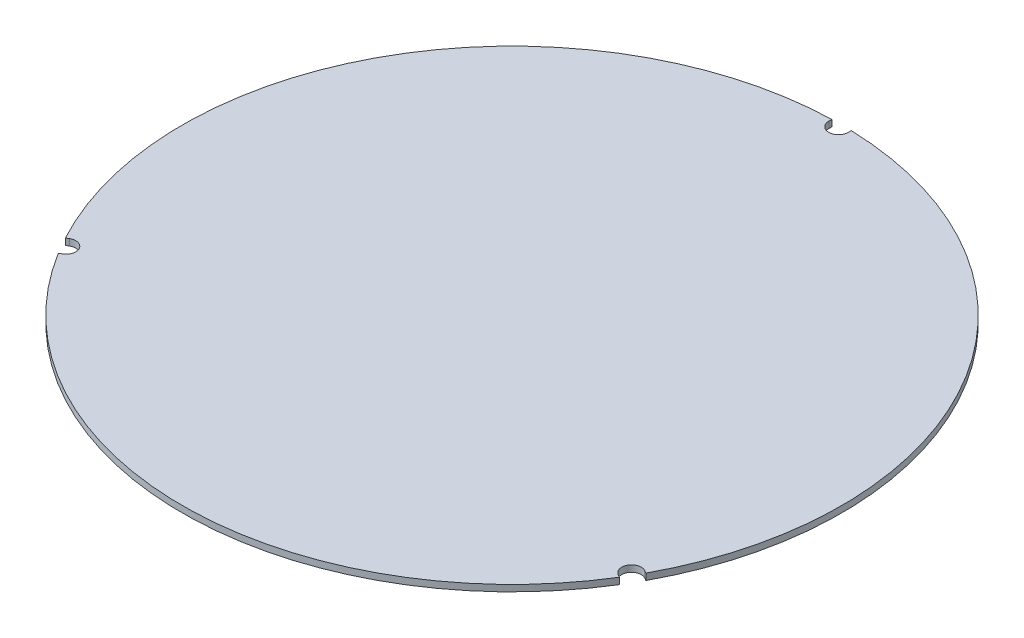
ISO-10303-21;
HEADER;
FILE_DESCRIPTION(('STEP AP214'),'2;1');
FILE_NAME('part.step','',(''),(''),'','','');
FILE_SCHEMA(('AUTOMOTIVE_DESIGN { 1 0 10303 214 1 1 1 1 }'));
ENDSEC;
DATA;
#1=APPLICATION_CONTEXT('core data for automotive mechanical design processes');
#2=APPLICATION_PROTOCOL_DEFINITION('international standard','automotive_design',2000,#1);
#3=PRODUCT_CONTEXT('',#1,'mechanical');
#4=PRODUCT('Part','Part','',(#3));
#5=PRODUCT_RELATED_PRODUCT_CATEGORY('part','',(#4));
#6=PRODUCT_DEFINITION_FORMATION('','',#4);
#7=PRODUCT_DEFINITION_CONTEXT('part definition',#1,'design');
#8=PRODUCT_DEFINITION('design','',#6,#7);
#9=PRODUCT_DEFINITION_SHAPE('','',#8);
#10=(LENGTH_UNIT() NAMED_UNIT(*) SI_UNIT(.MILLI.,.METRE.));
#11=(NAMED_UNIT(*) PLANE_ANGLE_UNIT() SI_UNIT($,.RADIAN.));
#12=(NAMED_UNIT(*) SI_UNIT($,.STERADIAN.) SOLID_ANGLE_UNIT());
#13=UNCERTAINTY_MEASURE_WITH_UNIT(LENGTH_MEASURE(1.E-05),#10,'distance_accuracy_value','');
#14=(GEOMETRIC_REPRESENTATION_CONTEXT(3) GLOBAL_UNCERTAINTY_ASSIGNED_CONTEXT((#13)) GLOBAL_UNIT_ASSIGNED_CONTEXT((#10,
#11,#12)) REPRESENTATION_CONTEXT('',''));
#15=CARTESIAN_POINT('',(0.,0.,0.));
#16=DIRECTION('',(0.,0.,1.));
#17=DIRECTION('',(1.,0.,0.));
#18=AXIS2_PLACEMENT_3D('',#15,#16,#17);
#19=CARTESIAN_POINT('',(0.,0.,-50.5));
#20=DIRECTION('',(0.,1.,0.));
#21=DIRECTION('',(0.,0.,1.));
#22=AXIS2_PLACEMENT_3D('',#19,#20,#21);
#23=CYLINDRICAL_SURFACE('',#22,1.5);
#24=CARTESIAN_POINT('',(0.,1.,-50.5));
#25=DIRECTION('',(0.,1.,0.));
#26=DIRECTION('',(0.,0.,1.));
#27=AXIS2_PLACEMENT_3D('',#24,#25,#26);
#28=CIRCLE('',#27,1.5);
#29=CARTESIAN_POINT('',(-1.5,1.,-50.5));
#30=VERTEX_POINT('',#29);
#31=CARTESIAN_POINT('',(1.5,1.,-50.5));
#32=VERTEX_POINT('',#31);
#33=EDGE_CURVE('E152',#30,#32,#28,.T.);
#34=ORIENTED_EDGE('',*,*,#33,.T.);
#35=DIRECTION('',(0.,1.,0.));
#36=VECTOR('',#35,1.);
#37=CARTESIAN_POINT('',(1.5,0.,-50.5));
#38=LINE('',#37,#36);
#39=CARTESIAN_POINT('',(1.5,0.,-50.5));
#40=VERTEX_POINT('',#39);
#41=EDGE_CURVE('E140',#40,#32,#38,.T.);
#42=ORIENTED_EDGE('',*,*,#41,.F.);
#43=CARTESIAN_POINT('',(0.,0.,-50.5));
#44=DIRECTION('',(0.,1.,0.));
#45=DIRECTION('',(0.,0.,1.));
#46=AXIS2_PLACEMENT_3D('',#43,#44,#45);
#47=CIRCLE('',#46,1.5);
#48=CARTESIAN_POINT('',(-1.5,0.,-50.5));
#49=VERTEX_POINT('',#48);
#50=EDGE_CURVE('E11',#49,#40,#47,.T.);
#51=ORIENTED_EDGE('',*,*,#50,.F.);
#52=DIRECTION('',(0.,1.,0.));
#53=VECTOR('',#52,1.);
#54=CARTESIAN_POINT('',(-1.5,0.,-50.5));
#55=LINE('',#54,#53);
#56=EDGE_CURVE('E129',#49,#30,#55,.T.);
#57=ORIENTED_EDGE('',*,*,#56,.T.);
#58=EDGE_LOOP('',(#34,#42,#51,#57));
#59=FACE_BOUND('',#58,.T.);
#60=ADVANCED_FACE('F41',(#59),#23,.F.);
#61=CARTESIAN_POINT('',(0.,1.,0.));
#62=DIRECTION('',(0.,-1.,0.));
#63=DIRECTION('',(0.,0.,-1.));
#64=AXIS2_PLACEMENT_3D('',#61,#62,#63);
#65=CYLINDRICAL_SURFACE('',#64,51.);
#66=CARTESIAN_POINT('',(0.,0.,0.));
#67=DIRECTION('',(0.,1.,0.));
#68=DIRECTION('',(0.,0.,1.));
#69=AXIS2_PLACEMENT_3D('',#66,#67,#68);
#70=CIRCLE('',#69,51.);
#71=CARTESIAN_POINT('',(44.8981879582846,0.,24.1899300962725));
#72=VERTEX_POINT('',#71);
#73=CARTESIAN_POINT('',(1.5,0.,-50.9779364038993));
#74=VERTEX_POINT('',#73);
#75=EDGE_CURVE('E220',#72,#74,#70,.T.);
#76=ORIENTED_EDGE('',*,*,#75,.T.);
#77=DIRECTION('',(0.,-1.,0.));
#78=VECTOR('',#77,1.);
#79=CARTESIAN_POINT('',(1.5,1.,-50.9779364038993));
#80=LINE('',#79,#78);
#81=CARTESIAN_POINT('',(1.5,1.,-50.9779364038993));
#82=VERTEX_POINT('',#81);
#83=EDGE_CURVE('E157',#74,#82,#80,.F.);
#84=ORIENTED_EDGE('',*,*,#83,.T.);
#85=CARTESIAN_POINT('',(0.,1.,0.));
#86=DIRECTION('',(0.,1.,0.));
#87=DIRECTION('',(0.,0.,1.));
#88=AXIS2_PLACEMENT_3D('',#85,#86,#87);
#89=CIRCLE('',#88,51.);
#90=CARTESIAN_POINT('',(44.8981879582846,1.,24.1899300962725));
#91=VERTEX_POINT('',#90);
#92=EDGE_CURVE('E49',#91,#82,#89,.T.);
#93=ORIENTED_EDGE('',*,*,#92,.F.);
#94=DIRECTION('',(0.,-1.,0.));
#95=VECTOR('',#94,1.);
#96=CARTESIAN_POINT('',(44.8981879582845,1.,24.1899300962725));
#97=LINE('',#96,#95);
#98=EDGE_CURVE('E199',#91,#72,#97,.T.);
#99=ORIENTED_EDGE('',*,*,#98,.T.);
#100=EDGE_LOOP('',(#76,#84,#93,#99));
#101=FACE_BOUND('',#100,.T.);
#102=ADVANCED_FACE('F251',(#101),#65,.T.);
#103=CARTESIAN_POINT('',(-1.5,1.,-50.9779364038993));
#104=VERTEX_POINT('',#103);
#105=CARTESIAN_POINT('',(-44.8981879582842,1.,24.1899300962732));
#106=VERTEX_POINT('',#105);
#107=EDGE_CURVE('E217',#104,#106,#89,.T.);
#108=ORIENTED_EDGE('',*,*,#107,.F.);
#109=DIRECTION('',(0.,-1.,0.));
#110=VECTOR('',#109,1.);
#111=CARTESIAN_POINT('',(-1.5,1.,-50.9779364038993));
#112=LINE('',#111,#110);
#113=CARTESIAN_POINT('',(-1.5,0.,-50.9779364038993));
#114=VERTEX_POINT('',#113);
#115=EDGE_CURVE('E155',#104,#114,#112,.T.);
#116=ORIENTED_EDGE('',*,*,#115,.T.);
#117=CARTESIAN_POINT('',(-44.8981879582842,0.,24.1899300962732));
#118=VERTEX_POINT('',#117);
#119=EDGE_CURVE('E148',#114,#118,#70,.T.);
#120=ORIENTED_EDGE('',*,*,#119,.T.);
#121=DIRECTION('',(0.,-1.,0.));
#122=VECTOR('',#121,1.);
#123=CARTESIAN_POINT('',(-44.8981879582842,1.,24.1899300962732));
#124=LINE('',#123,#122);
#125=EDGE_CURVE('E190',#118,#106,#124,.F.);
#126=ORIENTED_EDGE('',*,*,#125,.T.);
#127=EDGE_LOOP('',(#108,#116,#120,#126));
#128=FACE_BOUND('',#127,.T.);
#129=ADVANCED_FACE('F237',(#128),#65,.T.);
#130=CARTESIAN_POINT('',(-43.3981879582842,0.,26.7880063076265));
#131=VERTEX_POINT('',#130);
#132=CARTESIAN_POINT('',(43.3981879582846,0.,26.7880063076259));
#133=VERTEX_POINT('',#132);
#134=EDGE_CURVE('E204',#131,#133,#70,.T.);
#135=ORIENTED_EDGE('',*,*,#134,.T.);
#136=DIRECTION('',(0.,-1.,0.));
#137=VECTOR('',#136,1.);
#138=CARTESIAN_POINT('',(43.3981879582846,1.,26.7880063076259));
#139=LINE('',#138,#137);
#140=CARTESIAN_POINT('',(43.3981879582846,1.,26.7880063076259));
#141=VERTEX_POINT('',#140);
#142=EDGE_CURVE('E196',#133,#141,#139,.F.);
#143=ORIENTED_EDGE('',*,*,#142,.T.);
#144=CARTESIAN_POINT('',(-43.3981879582842,1.,26.7880063076265));
#145=VERTEX_POINT('',#144);
#146=EDGE_CURVE('E218',#145,#141,#89,.T.);
#147=ORIENTED_EDGE('',*,*,#146,.F.);
#148=DIRECTION('',(0.,-1.,0.));
#149=VECTOR('',#148,1.);
#150=CARTESIAN_POINT('',(-43.3981879582842,1.,26.7880063076265));
#151=LINE('',#150,#149);
#152=EDGE_CURVE('E193',#145,#131,#151,.T.);
#153=ORIENTED_EDGE('',*,*,#152,.T.);
#154=EDGE_LOOP('',(#135,#143,#147,#153));
#155=FACE_BOUND('',#154,.T.);
#156=ADVANCED_FACE('F43',(#155),#65,.T.);
#157=CARTESIAN_POINT('',(0.,1.,0.));
#158=DIRECTION('',(0.,1.,0.));
#159=DIRECTION('',(0.,0.,1.));
#160=AXIS2_PLACEMENT_3D('',#157,#158,#159);
#161=PLANE('',#160);
#162=DIRECTION('',(0.,0.,-1.));
#163=VECTOR('',#162,1.);
#164=CARTESIAN_POINT('',(1.5,1.,-51.5));
#165=LINE('',#164,#163);
#166=EDGE_CURVE('E171',#32,#82,#165,.T.);
#167=ORIENTED_EDGE('',*,*,#166,.F.);
#168=ORIENTED_EDGE('',*,*,#33,.F.);
#169=DIRECTION('',(0.,0.,1.));
#170=VECTOR('',#169,1.);
#171=CARTESIAN_POINT('',(-1.5,1.,-51.5));
#172=LINE('',#171,#170);
#173=EDGE_CURVE('E135',#104,#30,#172,.T.);
#174=ORIENTED_EDGE('',*,*,#173,.F.);
#175=ORIENTED_EDGE('',*,*,#107,.T.);
#176=DIRECTION('',(-0.866025403784438,0.,0.500000000000002));
#177=VECTOR('',#176,1.);
#178=CARTESIAN_POINT('',(-44.484282891114,1.,23.9509618943236));
#179=LINE('',#178,#177);
#180=CARTESIAN_POINT('',(-44.484282891114,1.,23.9509618943236));
#181=VERTEX_POINT('',#180);
#182=EDGE_CURVE('E181',#181,#106,#179,.T.);
#183=ORIENTED_EDGE('',*,*,#182,.F.);
#184=CARTESIAN_POINT('',(-43.734282891114,1.,25.2500000000002));
#185=DIRECTION('',(0.,1.,0.));
#186=DIRECTION('',(0.,0.,1.));
#187=AXIS2_PLACEMENT_3D('',#184,#185,#186);
#188=CIRCLE('',#187,1.5);
#189=CARTESIAN_POINT('',(-42.984282891114,1.,26.5490381056769));
#190=VERTEX_POINT('',#189);
#191=EDGE_CURVE('E205',#190,#181,#188,.T.);
#192=ORIENTED_EDGE('',*,*,#191,.F.);
#193=DIRECTION('',(0.86602540378444,0.,-0.499999999999998));
#194=VECTOR('',#193,1.);
#195=CARTESIAN_POINT('',(-43.8503082948985,1.,27.0490381056769));
#196=LINE('',#195,#194);
#197=EDGE_CURVE('E166',#145,#190,#196,.T.);
#198=ORIENTED_EDGE('',*,*,#197,.F.);
#199=ORIENTED_EDGE('',*,*,#146,.T.);
#200=DIRECTION('',(0.866025403784442,0.,0.499999999999994));
#201=VECTOR('',#200,1.);
#202=CARTESIAN_POINT('',(42.9842828911144,1.,26.5490381056762));
#203=LINE('',#202,#201);
#204=CARTESIAN_POINT('',(42.9842828911144,1.,26.5490381056762));
#205=VERTEX_POINT('',#204);
#206=EDGE_CURVE('E167',#205,#141,#203,.T.);
#207=ORIENTED_EDGE('',*,*,#206,.F.);
#208=CARTESIAN_POINT('',(43.7342828911144,1.,25.2499999999996));
#209=DIRECTION('',(0.,1.,0.));
#210=DIRECTION('',(0.,0.,1.));
#211=AXIS2_PLACEMENT_3D('',#208,#209,#210);
#212=CIRCLE('',#211,1.50000000000001);
#213=CARTESIAN_POINT('',(44.4842828911144,1.,23.9509618943229));
#214=VERTEX_POINT('',#213);
#215=EDGE_CURVE('E211',#214,#205,#212,.T.);
#216=ORIENTED_EDGE('',*,*,#215,.F.);
#217=DIRECTION('',(-0.866025403784441,0.,-0.499999999999996));
#218=VECTOR('',#217,1.);
#219=CARTESIAN_POINT('',(45.3503082948988,1.,24.4509618943229));
#220=LINE('',#219,#218);
#221=EDGE_CURVE('E56',#91,#214,#220,.T.);
#222=ORIENTED_EDGE('',*,*,#221,.F.);
#223=ORIENTED_EDGE('',*,*,#92,.T.);
#224=EDGE_LOOP('',(#167,#168,#174,#175,#183,#192,#198,#199,#207,#216,#222,#223));
#225=FACE_BOUND('',#224,.T.);
#226=ADVANCED_FACE('F234',(#225),#161,.T.);
#227=CARTESIAN_POINT('',(0.,0.,0.));
#228=DIRECTION('',(0.,1.,0.));
#229=DIRECTION('',(0.,0.,1.));
#230=AXIS2_PLACEMENT_3D('',#227,#228,#229);
#231=PLANE('',#230);
#232=ORIENTED_EDGE('',*,*,#50,.T.);
#233=DIRECTION('',(0.,0.,-1.));
#234=VECTOR('',#233,1.);
#235=CARTESIAN_POINT('',(1.5,0.,-51.5));
#236=LINE('',#235,#234);
#237=EDGE_CURVE('E149',#40,#74,#236,.T.);
#238=ORIENTED_EDGE('',*,*,#237,.T.);
#239=ORIENTED_EDGE('',*,*,#75,.F.);
#240=DIRECTION('',(-0.866025403784441,0.,-0.499999999999996));
#241=VECTOR('',#240,1.);
#242=CARTESIAN_POINT('',(45.3503082948988,0.,24.4509618943229));
#243=LINE('',#242,#241);
#244=CARTESIAN_POINT('',(44.4842828911144,0.,23.9509618943229));
#245=VERTEX_POINT('',#244);
#246=EDGE_CURVE('E169',#72,#245,#243,.T.);
#247=ORIENTED_EDGE('',*,*,#246,.T.);
#248=CARTESIAN_POINT('',(43.7342828911144,0.,25.2499999999996));
#249=DIRECTION('',(0.,1.,0.));
#250=DIRECTION('',(0.,0.,1.));
#251=AXIS2_PLACEMENT_3D('',#248,#249,#250);
#252=CIRCLE('',#251,1.50000000000001);
#253=CARTESIAN_POINT('',(42.9842828911144,0.,26.5490381056762));
#254=VERTEX_POINT('',#253);
#255=EDGE_CURVE('E202',#245,#254,#252,.T.);
#256=ORIENTED_EDGE('',*,*,#255,.T.);
#257=DIRECTION('',(0.866025403784442,0.,0.499999999999994));
#258=VECTOR('',#257,1.);
#259=CARTESIAN_POINT('',(42.9842828911144,0.,26.5490381056762));
#260=LINE('',#259,#258);
#261=EDGE_CURVE('E64',#254,#133,#260,.T.);
#262=ORIENTED_EDGE('',*,*,#261,.T.);
#263=ORIENTED_EDGE('',*,*,#134,.F.);
#264=DIRECTION('',(0.86602540378444,0.,-0.499999999999998));
#265=VECTOR('',#264,1.);
#266=CARTESIAN_POINT('',(-43.8503082948985,0.,27.0490381056769));
#267=LINE('',#266,#265);
#268=CARTESIAN_POINT('',(-42.984282891114,0.,26.5490381056769));
#269=VERTEX_POINT('',#268);
#270=EDGE_CURVE('E183',#131,#269,#267,.T.);
#271=ORIENTED_EDGE('',*,*,#270,.T.);
#272=CARTESIAN_POINT('',(-43.734282891114,0.,25.2500000000002));
#273=DIRECTION('',(0.,1.,0.));
#274=DIRECTION('',(0.,0.,1.));
#275=AXIS2_PLACEMENT_3D('',#272,#273,#274);
#276=CIRCLE('',#275,1.5);
#277=CARTESIAN_POINT('',(-44.484282891114,0.,23.9509618943236));
#278=VERTEX_POINT('',#277);
#279=EDGE_CURVE('E208',#269,#278,#276,.T.);
#280=ORIENTED_EDGE('',*,*,#279,.T.);
#281=DIRECTION('',(-0.866025403784438,0.,0.500000000000002));
#282=VECTOR('',#281,1.);
#283=CARTESIAN_POINT('',(-44.484282891114,0.,23.9509618943236));
#284=LINE('',#283,#282);
#285=EDGE_CURVE('E178',#278,#118,#284,.T.);
#286=ORIENTED_EDGE('',*,*,#285,.T.);
#287=ORIENTED_EDGE('',*,*,#119,.F.);
#288=DIRECTION('',(0.,0.,1.));
#289=VECTOR('',#288,1.);
#290=CARTESIAN_POINT('',(-1.5,0.,-51.5));
#291=LINE('',#290,#289);
#292=EDGE_CURVE('E132',#114,#49,#291,.T.);
#293=ORIENTED_EDGE('',*,*,#292,.T.);
#294=EDGE_LOOP('',(#232,#238,#239,#247,#256,#262,#263,#271,#280,#286,#287,#293));
#295=FACE_BOUND('',#294,.T.);
#296=ADVANCED_FACE('F144',(#295),#231,.F.);
#297=CARTESIAN_POINT('',(43.7342828911144,0.,25.2499999999996));
#298=DIRECTION('',(0.,1.,0.));
#299=DIRECTION('',(0.,0.,1.));
#300=AXIS2_PLACEMENT_3D('',#297,#298,#299);
#301=CYLINDRICAL_SURFACE('',#300,1.50000000000001);
#302=ORIENTED_EDGE('',*,*,#215,.T.);
#303=DIRECTION('',(0.,1.,0.));
#304=VECTOR('',#303,1.);
#305=CARTESIAN_POINT('',(42.9842828911144,0.,26.5490381056762));
#306=LINE('',#305,#304);
#307=EDGE_CURVE('E164',#254,#205,#306,.T.);
#308=ORIENTED_EDGE('',*,*,#307,.F.);
#309=ORIENTED_EDGE('',*,*,#255,.F.);
#310=DIRECTION('',(0.,1.,0.));
#311=VECTOR('',#310,1.);
#312=CARTESIAN_POINT('',(44.4842828911144,0.,23.9509618943229));
#313=LINE('',#312,#311);
#314=EDGE_CURVE('E162',#245,#214,#313,.T.);
#315=ORIENTED_EDGE('',*,*,#314,.T.);
#316=EDGE_LOOP('',(#302,#308,#309,#315));
#317=FACE_BOUND('',#316,.T.);
#318=ADVANCED_FACE('F248',(#317),#301,.F.);
#319=CARTESIAN_POINT('',(-43.734282891114,0.,25.2500000000002));
#320=DIRECTION('',(0.,1.,0.));
#321=DIRECTION('',(0.,0.,1.));
#322=AXIS2_PLACEMENT_3D('',#319,#320,#321);
#323=CYLINDRICAL_SURFACE('',#322,1.5);
#324=ORIENTED_EDGE('',*,*,#191,.T.);
#325=DIRECTION('',(0.,1.,0.));
#326=VECTOR('',#325,1.);
#327=CARTESIAN_POINT('',(-44.484282891114,0.,23.9509618943236));
#328=LINE('',#327,#326);
#329=EDGE_CURVE('E179',#278,#181,#328,.T.);
#330=ORIENTED_EDGE('',*,*,#329,.F.);
#331=ORIENTED_EDGE('',*,*,#279,.F.);
#332=DIRECTION('',(0.,1.,0.));
#333=VECTOR('',#332,1.);
#334=CARTESIAN_POINT('',(-42.984282891114,0.,26.5490381056769));
#335=LINE('',#334,#333);
#336=EDGE_CURVE('E175',#269,#190,#335,.T.);
#337=ORIENTED_EDGE('',*,*,#336,.T.);
#338=EDGE_LOOP('',(#324,#330,#331,#337));
#339=FACE_BOUND('',#338,.T.);
#340=ADVANCED_FACE('F243',(#339),#323,.F.);
#341=CARTESIAN_POINT('',(-1.5,0.,-51.5));
#342=DIRECTION('',(-1.,0.,0.));
#343=DIRECTION('',(0.,0.,1.));
#344=AXIS2_PLACEMENT_3D('',#341,#342,#343);
#345=PLANE('',#344);
#346=ORIENTED_EDGE('',*,*,#173,.T.);
#347=ORIENTED_EDGE('',*,*,#56,.F.);
#348=ORIENTED_EDGE('',*,*,#292,.F.);
#349=ORIENTED_EDGE('',*,*,#115,.F.);
#350=EDGE_LOOP('',(#346,#347,#348,#349));
#351=FACE_BOUND('',#350,.T.);
#352=ADVANCED_FACE('F131',(#351),#345,.F.);
#353=CARTESIAN_POINT('',(1.5,0.,-51.5));
#354=DIRECTION('',(1.,0.,0.));
#355=DIRECTION('',(0.,0.,-1.));
#356=AXIS2_PLACEMENT_3D('',#353,#354,#355);
#357=PLANE('',#356);
#358=ORIENTED_EDGE('',*,*,#237,.F.);
#359=ORIENTED_EDGE('',*,*,#41,.T.);
#360=ORIENTED_EDGE('',*,*,#166,.T.);
#361=ORIENTED_EDGE('',*,*,#83,.F.);
#362=EDGE_LOOP('',(#358,#359,#360,#361));
#363=FACE_BOUND('',#362,.T.);
#364=ADVANCED_FACE('F252',(#363),#357,.F.);
#365=CARTESIAN_POINT('',(-43.8503082948985,0.,27.0490381056769));
#366=DIRECTION('',(0.499999999999998,0.,0.86602540378444));
#367=DIRECTION('',(0.86602540378444,0.,-0.499999999999998));
#368=AXIS2_PLACEMENT_3D('',#365,#366,#367);
#369=PLANE('',#368);
#370=ORIENTED_EDGE('',*,*,#197,.T.);
#371=ORIENTED_EDGE('',*,*,#336,.F.);
#372=ORIENTED_EDGE('',*,*,#270,.F.);
#373=ORIENTED_EDGE('',*,*,#152,.F.);
#374=EDGE_LOOP('',(#370,#371,#372,#373));
#375=FACE_BOUND('',#374,.T.);
#376=ADVANCED_FACE('F255',(#375),#369,.F.);
#377=CARTESIAN_POINT('',(-44.484282891114,0.,23.9509618943236));
#378=DIRECTION('',(-0.500000000000002,0.,-0.866025403784438));
#379=DIRECTION('',(-0.866025403784438,0.,0.500000000000002));
#380=AXIS2_PLACEMENT_3D('',#377,#378,#379);
#381=PLANE('',#380);
#382=ORIENTED_EDGE('',*,*,#285,.F.);
#383=ORIENTED_EDGE('',*,*,#329,.T.);
#384=ORIENTED_EDGE('',*,*,#182,.T.);
#385=ORIENTED_EDGE('',*,*,#125,.F.);
#386=EDGE_LOOP('',(#382,#383,#384,#385));
#387=FACE_BOUND('',#386,.T.);
#388=ADVANCED_FACE('F239',(#387),#381,.F.);
#389=CARTESIAN_POINT('',(45.3503082948988,0.,24.4509618943229));
#390=DIRECTION('',(0.499999999999996,0.,-0.866025403784441));
#391=DIRECTION('',(-0.866025403784441,0.,-0.499999999999996));
#392=AXIS2_PLACEMENT_3D('',#389,#390,#391);
#393=PLANE('',#392);
#394=ORIENTED_EDGE('',*,*,#221,.T.);
#395=ORIENTED_EDGE('',*,*,#314,.F.);
#396=ORIENTED_EDGE('',*,*,#246,.F.);
#397=ORIENTED_EDGE('',*,*,#98,.F.);
#398=EDGE_LOOP('',(#394,#395,#396,#397));
#399=FACE_BOUND('',#398,.T.);
#400=ADVANCED_FACE('F322',(#399),#393,.F.);
#401=CARTESIAN_POINT('',(42.9842828911144,0.,26.5490381056762));
#402=DIRECTION('',(-0.499999999999994,0.,0.866025403784442));
#403=DIRECTION('',(0.866025403784442,0.,0.499999999999994));
#404=AXIS2_PLACEMENT_3D('',#401,#402,#403);
#405=PLANE('',#404);
#406=ORIENTED_EDGE('',*,*,#261,.F.);
#407=ORIENTED_EDGE('',*,*,#307,.T.);
#408=ORIENTED_EDGE('',*,*,#206,.T.);
#409=ORIENTED_EDGE('',*,*,#142,.F.);
#410=EDGE_LOOP('',(#406,#407,#408,#409));
#411=FACE_BOUND('',#410,.T.);
#412=ADVANCED_FACE('F245',(#411),#405,.F.);
#413=CLOSED_SHELL('',(#60,#102,#129,#156,#226,#296,#318,#340,#352,#364,#376,#388,#400,#412));
#414=MANIFOLD_SOLID_BREP('B2',#413);
#415=ADVANCED_BREP_SHAPE_REPRESENTATION('',(#18,#414),#14);
#416=SHAPE_DEFINITION_REPRESENTATION(#9,#415);
ENDSEC;
END-ISO-10303-21;
